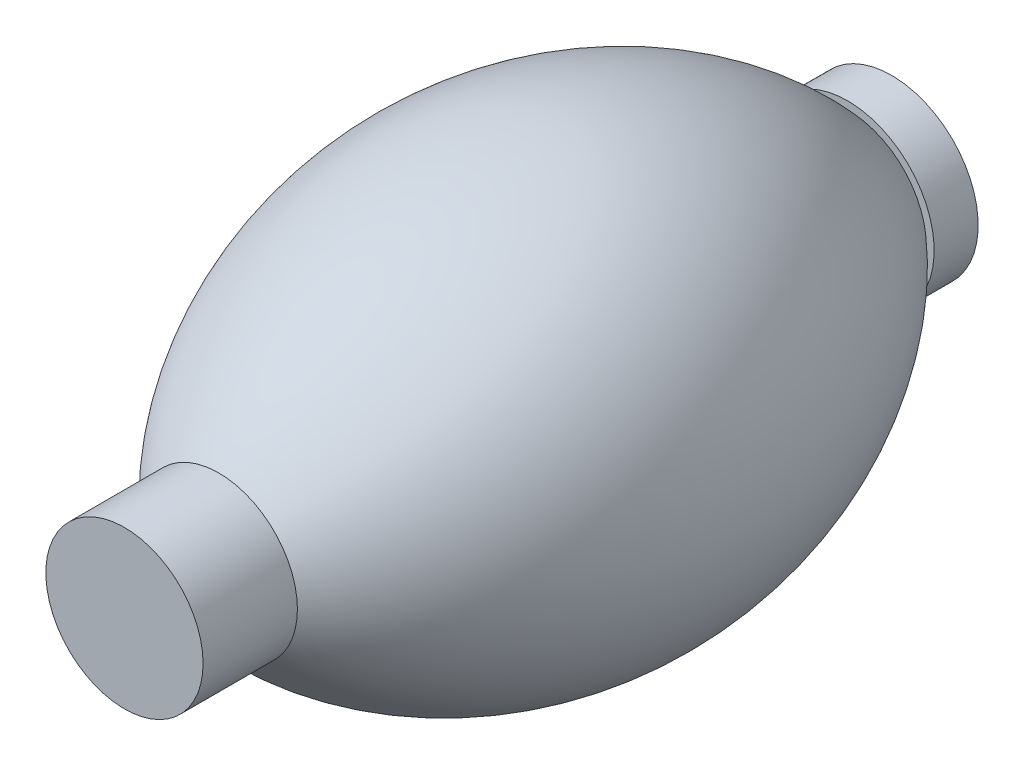
ISO-10303-21;
HEADER;
FILE_DESCRIPTION(('STEP AP214'),'2;1');
FILE_NAME('part.step','',(''),(''),'','','');
FILE_SCHEMA(('AUTOMOTIVE_DESIGN { 1 0 10303 214 1 1 1 1 }'));
ENDSEC;
DATA;
#1=APPLICATION_CONTEXT('core data for automotive mechanical design processes');
#2=APPLICATION_PROTOCOL_DEFINITION('international standard','automotive_design',2000,#1);
#3=PRODUCT_CONTEXT('',#1,'mechanical');
#4=PRODUCT('Part','Part','',(#3));
#5=PRODUCT_RELATED_PRODUCT_CATEGORY('part','',(#4));
#6=PRODUCT_DEFINITION_FORMATION('','',#4);
#7=PRODUCT_DEFINITION_CONTEXT('part definition',#1,'design');
#8=PRODUCT_DEFINITION('design','',#6,#7);
#9=PRODUCT_DEFINITION_SHAPE('','',#8);
#10=(LENGTH_UNIT() NAMED_UNIT(*) SI_UNIT(.MILLI.,.METRE.));
#11=(NAMED_UNIT(*) PLANE_ANGLE_UNIT() SI_UNIT($,.RADIAN.));
#12=(NAMED_UNIT(*) SI_UNIT($,.STERADIAN.) SOLID_ANGLE_UNIT());
#13=UNCERTAINTY_MEASURE_WITH_UNIT(LENGTH_MEASURE(1.E-05),#10,'distance_accuracy_value','');
#14=(GEOMETRIC_REPRESENTATION_CONTEXT(3) GLOBAL_UNCERTAINTY_ASSIGNED_CONTEXT((#13)) GLOBAL_UNIT_ASSIGNED_CONTEXT((#10,
#11,#12)) REPRESENTATION_CONTEXT('',''));
#15=CARTESIAN_POINT('',(0.,0.,0.));
#16=DIRECTION('',(0.,0.,1.));
#17=DIRECTION('',(1.,0.,0.));
#18=AXIS2_PLACEMENT_3D('',#15,#16,#17);
#19=CARTESIAN_POINT('',(0.,0.,0.));
#20=DIRECTION('',(0.,0.,1.));
#21=DIRECTION('',(1.,0.,0.));
#22=AXIS2_PLACEMENT_3D('',#19,#20,#21);
#23=DEGENERATE_TOROIDAL_SURFACE('',#22,63.5488962514659,133.569858229141,.F.);
#24=CARTESIAN_POINT('',(0.,0.,100.));
#25=DIRECTION('',(0.,0.,1.));
#26=DIRECTION('',(1.,0.,0.));
#27=AXIS2_PLACEMENT_3D('',#24,#25,#26);
#28=CIRCLE('',#27,25.);
#29=CARTESIAN_POINT('',(25.,0.,100.));
#30=VERTEX_POINT('',#29);
#31=EDGE_CURVE('E10',#30,#30,#28,.T.);
#32=ORIENTED_EDGE('',*,*,#31,.F.);
#33=EDGE_LOOP('',(#32));
#34=FACE_BOUND('',#33,.T.);
#35=CARTESIAN_POINT('',(0.,0.,-100.));
#36=DIRECTION('',(0.,0.,1.));
#37=DIRECTION('',(1.,0.,0.));
#38=AXIS2_PLACEMENT_3D('',#35,#36,#37);
#39=CIRCLE('',#38,25.);
#40=CARTESIAN_POINT('',(25.,0.,-100.));
#41=VERTEX_POINT('',#40);
#42=EDGE_CURVE('E45',#41,#41,#39,.T.);
#43=ORIENTED_EDGE('',*,*,#42,.T.);
#44=EDGE_LOOP('',(#43));
#45=FACE_BOUND('',#44,.T.);
#46=ADVANCED_FACE('F35',(#34,#45),#23,.F.);
#47=CARTESIAN_POINT('',(0.,0.,130.));
#48=DIRECTION('',(0.,0.,-1.));
#49=DIRECTION('',(-1.,0.,0.));
#50=AXIS2_PLACEMENT_3D('',#47,#48,#49);
#51=CYLINDRICAL_SURFACE('',#50,25.);
#52=CARTESIAN_POINT('',(0.,0.,130.));
#53=DIRECTION('',(0.,0.,1.));
#54=DIRECTION('',(1.,0.,0.));
#55=AXIS2_PLACEMENT_3D('',#52,#53,#54);
#56=CIRCLE('',#55,25.);
#57=CARTESIAN_POINT('',(25.,0.,130.));
#58=VERTEX_POINT('',#57);
#59=EDGE_CURVE('E41',#58,#58,#56,.T.);
#60=ORIENTED_EDGE('',*,*,#59,.F.);
#61=EDGE_LOOP('',(#60));
#62=FACE_BOUND('',#61,.T.);
#63=ORIENTED_EDGE('',*,*,#31,.T.);
#64=EDGE_LOOP('',(#63));
#65=FACE_BOUND('',#64,.T.);
#66=ADVANCED_FACE('F78',(#62,#65),#51,.T.);
#67=CARTESIAN_POINT('',(0.,0.,130.));
#68=DIRECTION('',(0.,0.,1.));
#69=DIRECTION('',(1.,0.,0.));
#70=AXIS2_PLACEMENT_3D('',#67,#68,#69);
#71=PLANE('',#70);
#72=ORIENTED_EDGE('',*,*,#59,.T.);
#73=EDGE_LOOP('',(#72));
#74=FACE_BOUND('',#73,.T.);
#75=ADVANCED_FACE('F63',(#74),#71,.T.);
#76=CARTESIAN_POINT('',(0.,0.,-114.));
#77=DIRECTION('',(0.,0.,1.));
#78=DIRECTION('',(1.,0.,0.));
#79=AXIS2_PLACEMENT_3D('',#76,#77,#78);
#80=CYLINDRICAL_SURFACE('',#79,27.5);
#81=CARTESIAN_POINT('',(0.,0.,-114.));
#82=DIRECTION('',(0.,0.,-1.));
#83=DIRECTION('',(-1.,0.,0.));
#84=AXIS2_PLACEMENT_3D('',#81,#82,#83);
#85=CIRCLE('',#84,27.5);
#86=CARTESIAN_POINT('',(-27.5,0.,-114.));
#87=VERTEX_POINT('',#86);
#88=EDGE_CURVE('E50',#87,#87,#85,.T.);
#89=ORIENTED_EDGE('',*,*,#88,.F.);
#90=EDGE_LOOP('',(#89));
#91=FACE_BOUND('',#90,.T.);
#92=CARTESIAN_POINT('',(0.,0.,-100.));
#93=DIRECTION('',(0.,0.,-1.));
#94=DIRECTION('',(-1.,0.,0.));
#95=AXIS2_PLACEMENT_3D('',#92,#93,#94);
#96=CIRCLE('',#95,27.5);
#97=CARTESIAN_POINT('',(-27.5,0.,-100.));
#98=VERTEX_POINT('',#97);
#99=EDGE_CURVE('E52',#98,#98,#96,.T.);
#100=ORIENTED_EDGE('',*,*,#99,.T.);
#101=EDGE_LOOP('',(#100));
#102=FACE_BOUND('',#101,.T.);
#103=ADVANCED_FACE('F60',(#91,#102),#80,.T.);
#104=CARTESIAN_POINT('',(0.,0.,-114.));
#105=DIRECTION('',(0.,0.,-1.));
#106=DIRECTION('',(-1.,0.,0.));
#107=AXIS2_PLACEMENT_3D('',#104,#105,#106);
#108=PLANE('',#107);
#109=ORIENTED_EDGE('',*,*,#88,.T.);
#110=EDGE_LOOP('',(#109));
#111=FACE_BOUND('',#110,.T.);
#112=ADVANCED_FACE('F58',(#111),#108,.T.);
#113=CARTESIAN_POINT('',(0.,0.,-100.));
#114=DIRECTION('',(0.,0.,-1.));
#115=DIRECTION('',(-1.,0.,0.));
#116=AXIS2_PLACEMENT_3D('',#113,#114,#115);
#117=PLANE('',#116);
#118=ORIENTED_EDGE('',*,*,#42,.F.);
#119=EDGE_LOOP('',(#118));
#120=FACE_BOUND('',#119,.T.);
#121=ORIENTED_EDGE('',*,*,#99,.F.);
#122=EDGE_LOOP('',(#121));
#123=FACE_BOUND('',#122,.T.);
#124=ADVANCED_FACE('F67',(#120,#123),#117,.F.);
#125=CLOSED_SHELL('',(#46,#66,#75,#103,#112,#124));
#126=MANIFOLD_SOLID_BREP('B2',#125);
#127=ADVANCED_BREP_SHAPE_REPRESENTATION('',(#18,#126),#14);
#128=SHAPE_DEFINITION_REPRESENTATION(#9,#127);
ENDSEC;
END-ISO-10303-21;
